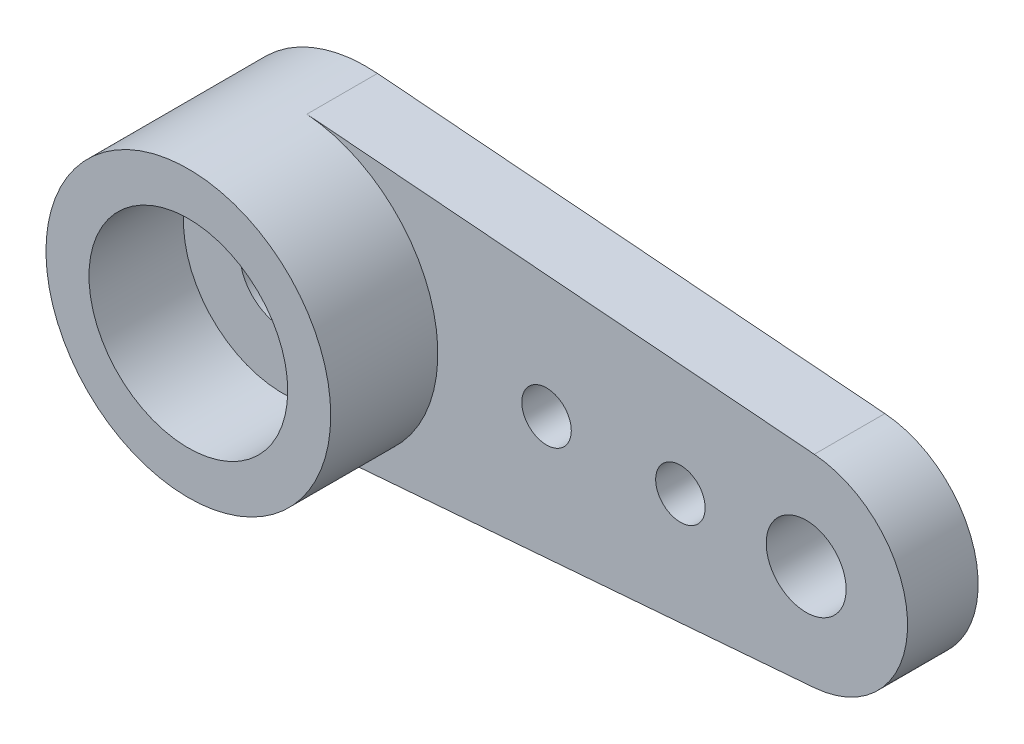
ISO-10303-21;
HEADER;
FILE_DESCRIPTION(('STEP AP214'),'2;1');
FILE_NAME('part.step','',(''),(''),'','','');
FILE_SCHEMA(('AUTOMOTIVE_DESIGN { 1 0 10303 214 1 1 1 1 }'));
ENDSEC;
DATA;
#1=APPLICATION_CONTEXT('core data for automotive mechanical design processes');
#2=APPLICATION_PROTOCOL_DEFINITION('international standard','automotive_design',2000,#1);
#3=PRODUCT_CONTEXT('',#1,'mechanical');
#4=PRODUCT('Part','Part','',(#3));
#5=PRODUCT_RELATED_PRODUCT_CATEGORY('part','',(#4));
#6=PRODUCT_DEFINITION_FORMATION('','',#4);
#7=PRODUCT_DEFINITION_CONTEXT('part definition',#1,'design');
#8=PRODUCT_DEFINITION('design','',#6,#7);
#9=PRODUCT_DEFINITION_SHAPE('','',#8);
#10=(LENGTH_UNIT() NAMED_UNIT(*) SI_UNIT(.MILLI.,.METRE.));
#11=(NAMED_UNIT(*) PLANE_ANGLE_UNIT() SI_UNIT($,.RADIAN.));
#12=(NAMED_UNIT(*) SI_UNIT($,.STERADIAN.) SOLID_ANGLE_UNIT());
#13=UNCERTAINTY_MEASURE_WITH_UNIT(LENGTH_MEASURE(1.E-05),#10,'distance_accuracy_value','');
#14=(GEOMETRIC_REPRESENTATION_CONTEXT(3) GLOBAL_UNCERTAINTY_ASSIGNED_CONTEXT((#13)) GLOBAL_UNIT_ASSIGNED_CONTEXT((#10,
#11,#12)) REPRESENTATION_CONTEXT('',''));
#15=CARTESIAN_POINT('',(0.,0.,0.));
#16=DIRECTION('',(0.,0.,1.));
#17=DIRECTION('',(1.,0.,0.));
#18=AXIS2_PLACEMENT_3D('',#15,#16,#17);
#19=CARTESIAN_POINT('',(0.,0.,1.74));
#20=DIRECTION('',(0.,0.,1.));
#21=DIRECTION('',(1.,0.,0.));
#22=AXIS2_PLACEMENT_3D('',#19,#20,#21);
#23=PLANE('',#22);
#24=CARTESIAN_POINT('',(12.59,0.,1.74));
#25=DIRECTION('',(0.,0.,1.));
#26=DIRECTION('',(1.,0.,0.));
#27=AXIS2_PLACEMENT_3D('',#24,#25,#26);
#28=CIRCLE('',#27,0.985);
#29=CARTESIAN_POINT('',(13.575,0.,1.74));
#30=VERTEX_POINT('',#29);
#31=EDGE_CURVE('E109',#30,#30,#28,.T.);
#32=ORIENTED_EDGE('',*,*,#31,.F.);
#33=EDGE_LOOP('',(#32));
#34=FACE_BOUND('',#33,.T.);
#35=CARTESIAN_POINT('',(9.49,0.,1.74));
#36=DIRECTION('',(0.,0.,1.));
#37=DIRECTION('',(1.,0.,0.));
#38=AXIS2_PLACEMENT_3D('',#35,#36,#37);
#39=CIRCLE('',#38,0.61);
#40=CARTESIAN_POINT('',(10.1,0.,1.74));
#41=VERTEX_POINT('',#40);
#42=EDGE_CURVE('E101',#41,#41,#39,.T.);
#43=ORIENTED_EDGE('',*,*,#42,.F.);
#44=EDGE_LOOP('',(#43));
#45=FACE_BOUND('',#44,.T.);
#46=CARTESIAN_POINT('',(6.19,0.,1.74));
#47=DIRECTION('',(0.,0.,1.));
#48=DIRECTION('',(1.,0.,0.));
#49=AXIS2_PLACEMENT_3D('',#46,#47,#48);
#50=CIRCLE('',#49,0.609999999999999);
#51=CARTESIAN_POINT('',(6.8,0.,1.74));
#52=VERTEX_POINT('',#51);
#53=EDGE_CURVE('E98',#52,#52,#50,.T.);
#54=ORIENTED_EDGE('',*,*,#53,.F.);
#55=EDGE_LOOP('',(#54));
#56=FACE_BOUND('',#55,.T.);
#57=DIRECTION('',(0.996776989472641,-0.0802223987291502,0.));
#58=VECTOR('',#57,1.);
#59=CARTESIAN_POINT('',(0.281580619539317,3.49868723304897,1.74));
#60=LINE('',#59,#58);
#61=CARTESIAN_POINT('',(0.281580619539317,3.49868723304897,1.74));
#62=VERTEX_POINT('',#61);
#63=CARTESIAN_POINT('',(12.7905559968229,2.4919424736816,1.74));
#64=VERTEX_POINT('',#63);
#65=EDGE_CURVE('E94',#62,#64,#60,.T.);
#66=ORIENTED_EDGE('',*,*,#65,.F.);
#67=CARTESIAN_POINT('',(0.,0.,1.74));
#68=DIRECTION('',(0.,0.,1.));
#69=DIRECTION('',(1.,0.,0.));
#70=AXIS2_PLACEMENT_3D('',#67,#68,#69);
#71=CIRCLE('',#70,3.51);
#72=CARTESIAN_POINT('',(0.281580619539316,-3.49868723304897,1.74));
#73=VERTEX_POINT('',#72);
#74=EDGE_CURVE('E56',#62,#73,#71,.F.);
#75=ORIENTED_EDGE('',*,*,#74,.T.);
#76=DIRECTION('',(0.996776989472641,0.0802223987291503,0.));
#77=VECTOR('',#76,1.);
#78=CARTESIAN_POINT('',(0.281580619539318,-3.49868723304897,1.74));
#79=LINE('',#78,#77);
#80=CARTESIAN_POINT('',(12.7905559968229,-2.4919424736816,1.74));
#81=VERTEX_POINT('',#80);
#82=EDGE_CURVE('E103',#73,#81,#79,.T.);
#83=ORIENTED_EDGE('',*,*,#82,.T.);
#84=CARTESIAN_POINT('',(12.59,0.,1.74));
#85=DIRECTION('',(0.,0.,1.));
#86=DIRECTION('',(1.,0.,0.));
#87=AXIS2_PLACEMENT_3D('',#84,#85,#86);
#88=CIRCLE('',#87,2.5);
#89=EDGE_CURVE('E81',#81,#64,#88,.T.);
#90=ORIENTED_EDGE('',*,*,#89,.T.);
#91=EDGE_LOOP('',(#66,#75,#83,#90));
#92=FACE_BOUND('',#91,.T.);
#93=ADVANCED_FACE('F39',(#34,#45,#56,#92),#23,.T.);
#94=CARTESIAN_POINT('',(0.281580619539318,-3.49868723304897,1.74));
#95=DIRECTION('',(-0.0802223987291502,0.996776989472641,0.));
#96=DIRECTION('',(-0.996776989472641,-0.0802223987291503,0.));
#97=AXIS2_PLACEMENT_3D('',#94,#95,#96);
#98=PLANE('',#97);
#99=DIRECTION('',(0.996776989472641,0.0802223987291503,0.));
#100=VECTOR('',#99,1.);
#101=CARTESIAN_POINT('',(0.281580619539318,-3.49868723304897,0.));
#102=LINE('',#101,#100);
#103=CARTESIAN_POINT('',(0.281580619539316,-3.49868723304897,0.));
#104=VERTEX_POINT('',#103);
#105=CARTESIAN_POINT('',(12.7905559968229,-2.4919424736816,0.));
#106=VERTEX_POINT('',#105);
#107=EDGE_CURVE('E87',#104,#106,#102,.T.);
#108=ORIENTED_EDGE('',*,*,#107,.T.);
#109=DIRECTION('',(0.,0.,-1.));
#110=VECTOR('',#109,1.);
#111=CARTESIAN_POINT('',(12.7905559968229,-2.4919424736816,1.74));
#112=LINE('',#111,#110);
#113=EDGE_CURVE('E11',#81,#106,#112,.T.);
#114=ORIENTED_EDGE('',*,*,#113,.F.);
#115=ORIENTED_EDGE('',*,*,#82,.F.);
#116=DIRECTION('',(0.,0.,-1.));
#117=VECTOR('',#116,1.);
#118=CARTESIAN_POINT('',(0.281580619539316,-3.49868723304897,1.74));
#119=LINE('',#118,#117);
#120=EDGE_CURVE('E85',#73,#104,#119,.T.);
#121=ORIENTED_EDGE('',*,*,#120,.T.);
#122=EDGE_LOOP('',(#108,#114,#115,#121));
#123=FACE_BOUND('',#122,.T.);
#124=ADVANCED_FACE('F41',(#123),#98,.F.);
#125=CARTESIAN_POINT('',(12.59,0.,1.74));
#126=DIRECTION('',(0.,0.,-1.));
#127=DIRECTION('',(-1.,0.,0.));
#128=AXIS2_PLACEMENT_3D('',#125,#126,#127);
#129=CYLINDRICAL_SURFACE('',#128,2.5);
#130=CARTESIAN_POINT('',(12.59,0.,0.));
#131=DIRECTION('',(0.,0.,1.));
#132=DIRECTION('',(1.,0.,0.));
#133=AXIS2_PLACEMENT_3D('',#130,#131,#132);
#134=CIRCLE('',#133,2.5);
#135=CARTESIAN_POINT('',(12.7905559968229,2.4919424736816,0.));
#136=VERTEX_POINT('',#135);
#137=EDGE_CURVE('E114',#106,#136,#134,.T.);
#138=ORIENTED_EDGE('',*,*,#137,.T.);
#139=DIRECTION('',(0.,0.,-1.));
#140=VECTOR('',#139,1.);
#141=CARTESIAN_POINT('',(12.7905559968229,2.4919424736816,1.74));
#142=LINE('',#141,#140);
#143=EDGE_CURVE('E48',#64,#136,#142,.T.);
#144=ORIENTED_EDGE('',*,*,#143,.F.);
#145=ORIENTED_EDGE('',*,*,#89,.F.);
#146=ORIENTED_EDGE('',*,*,#113,.T.);
#147=EDGE_LOOP('',(#138,#144,#145,#146));
#148=FACE_BOUND('',#147,.T.);
#149=ADVANCED_FACE('F128',(#148),#129,.T.);
#150=CARTESIAN_POINT('',(0.281580619539317,3.49868723304897,1.74));
#151=DIRECTION('',(0.0802223987291502,0.996776989472641,0.));
#152=DIRECTION('',(-0.996776989472641,0.0802223987291502,0.));
#153=AXIS2_PLACEMENT_3D('',#150,#151,#152);
#154=PLANE('',#153);
#155=DIRECTION('',(0.996776989472641,-0.0802223987291502,0.));
#156=VECTOR('',#155,1.);
#157=CARTESIAN_POINT('',(0.281580619539317,3.49868723304897,0.));
#158=LINE('',#157,#156);
#159=CARTESIAN_POINT('',(0.281580619539317,3.49868723304897,0.));
#160=VERTEX_POINT('',#159);
#161=EDGE_CURVE('E96',#160,#136,#158,.T.);
#162=ORIENTED_EDGE('',*,*,#161,.F.);
#163=DIRECTION('',(0.,0.,-1.));
#164=VECTOR('',#163,1.);
#165=CARTESIAN_POINT('',(0.281580619539317,3.49868723304897,1.74));
#166=LINE('',#165,#164);
#167=EDGE_CURVE('E74',#62,#160,#166,.T.);
#168=ORIENTED_EDGE('',*,*,#167,.F.);
#169=ORIENTED_EDGE('',*,*,#65,.T.);
#170=ORIENTED_EDGE('',*,*,#143,.T.);
#171=EDGE_LOOP('',(#162,#168,#169,#170));
#172=FACE_BOUND('',#171,.T.);
#173=ADVANCED_FACE('F93',(#172),#154,.T.);
#174=CARTESIAN_POINT('',(9.49,0.,1.74));
#175=DIRECTION('',(0.,0.,-1.));
#176=DIRECTION('',(-1.,0.,0.));
#177=AXIS2_PLACEMENT_3D('',#174,#175,#176);
#178=CYLINDRICAL_SURFACE('',#177,0.61);
#179=ORIENTED_EDGE('',*,*,#42,.T.);
#180=EDGE_LOOP('',(#179));
#181=FACE_BOUND('',#180,.T.);
#182=CARTESIAN_POINT('',(9.49,0.,0.));
#183=DIRECTION('',(0.,0.,1.));
#184=DIRECTION('',(1.,0.,0.));
#185=AXIS2_PLACEMENT_3D('',#182,#183,#184);
#186=CIRCLE('',#185,0.61);
#187=CARTESIAN_POINT('',(10.1,0.,0.));
#188=VERTEX_POINT('',#187);
#189=EDGE_CURVE('E122',#188,#188,#186,.T.);
#190=ORIENTED_EDGE('',*,*,#189,.F.);
#191=EDGE_LOOP('',(#190));
#192=FACE_BOUND('',#191,.T.);
#193=ADVANCED_FACE('F236',(#181,#192),#178,.F.);
#194=CARTESIAN_POINT('',(6.19,0.,1.74));
#195=DIRECTION('',(0.,0.,-1.));
#196=DIRECTION('',(-1.,0.,0.));
#197=AXIS2_PLACEMENT_3D('',#194,#195,#196);
#198=CYLINDRICAL_SURFACE('',#197,0.609999999999999);
#199=ORIENTED_EDGE('',*,*,#53,.T.);
#200=EDGE_LOOP('',(#199));
#201=FACE_BOUND('',#200,.T.);
#202=CARTESIAN_POINT('',(6.19,0.,0.));
#203=DIRECTION('',(0.,0.,1.));
#204=DIRECTION('',(1.,0.,0.));
#205=AXIS2_PLACEMENT_3D('',#202,#203,#204);
#206=CIRCLE('',#205,0.609999999999999);
#207=CARTESIAN_POINT('',(6.8,0.,0.));
#208=VERTEX_POINT('',#207);
#209=EDGE_CURVE('E119',#208,#208,#206,.T.);
#210=ORIENTED_EDGE('',*,*,#209,.F.);
#211=EDGE_LOOP('',(#210));
#212=FACE_BOUND('',#211,.T.);
#213=ADVANCED_FACE('F231',(#201,#212),#198,.F.);
#214=CARTESIAN_POINT('',(0.,0.,1.74));
#215=DIRECTION('',(0.,0.,-1.));
#216=DIRECTION('',(-1.,0.,0.));
#217=AXIS2_PLACEMENT_3D('',#214,#215,#216);
#218=CYLINDRICAL_SURFACE('',#217,3.51);
#219=CARTESIAN_POINT('',(0.,0.,0.));
#220=DIRECTION('',(0.,0.,1.));
#221=DIRECTION('',(1.,0.,0.));
#222=AXIS2_PLACEMENT_3D('',#219,#220,#221);
#223=CIRCLE('',#222,3.51);
#224=EDGE_CURVE('E76',#160,#104,#223,.T.);
#225=ORIENTED_EDGE('',*,*,#224,.T.);
#226=ORIENTED_EDGE('',*,*,#120,.F.);
#227=ORIENTED_EDGE('',*,*,#74,.F.);
#228=ORIENTED_EDGE('',*,*,#167,.T.);
#229=EDGE_LOOP('',(#225,#226,#227,#228));
#230=FACE_BOUND('',#229,.T.);
#231=CARTESIAN_POINT('',(0.,0.,4.38));
#232=DIRECTION('',(0.,0.,1.));
#233=DIRECTION('',(1.,0.,0.));
#234=AXIS2_PLACEMENT_3D('',#231,#232,#233);
#235=CIRCLE('',#234,3.51);
#236=CARTESIAN_POINT('',(3.51,0.,4.38));
#237=VERTEX_POINT('',#236);
#238=EDGE_CURVE('E88',#237,#237,#235,.T.);
#239=ORIENTED_EDGE('',*,*,#238,.F.);
#240=EDGE_LOOP('',(#239));
#241=FACE_BOUND('',#240,.T.);
#242=ADVANCED_FACE('F83',(#230,#241),#218,.T.);
#243=CARTESIAN_POINT('',(12.59,0.,1.74));
#244=DIRECTION('',(0.,0.,-1.));
#245=DIRECTION('',(-1.,0.,0.));
#246=AXIS2_PLACEMENT_3D('',#243,#244,#245);
#247=CYLINDRICAL_SURFACE('',#246,0.985);
#248=ORIENTED_EDGE('',*,*,#31,.T.);
#249=EDGE_LOOP('',(#248));
#250=FACE_BOUND('',#249,.T.);
#251=CARTESIAN_POINT('',(12.59,0.,0.));
#252=DIRECTION('',(0.,0.,1.));
#253=DIRECTION('',(1.,0.,0.));
#254=AXIS2_PLACEMENT_3D('',#251,#252,#253);
#255=CIRCLE('',#254,0.985);
#256=CARTESIAN_POINT('',(13.575,0.,0.));
#257=VERTEX_POINT('',#256);
#258=EDGE_CURVE('E125',#257,#257,#255,.T.);
#259=ORIENTED_EDGE('',*,*,#258,.F.);
#260=EDGE_LOOP('',(#259));
#261=FACE_BOUND('',#260,.T.);
#262=ADVANCED_FACE('F193',(#250,#261),#247,.F.);
#263=CARTESIAN_POINT('',(0.,0.,0.));
#264=DIRECTION('',(0.,0.,1.));
#265=DIRECTION('',(1.,0.,0.));
#266=AXIS2_PLACEMENT_3D('',#263,#264,#265);
#267=PLANE('',#266);
#268=CARTESIAN_POINT('',(0.,0.,0.));
#269=DIRECTION('',(0.,0.,1.));
#270=DIRECTION('',(1.,0.,0.));
#271=AXIS2_PLACEMENT_3D('',#268,#269,#270);
#272=CIRCLE('',#271,2.7);
#273=CARTESIAN_POINT('',(2.7,0.,0.));
#274=VERTEX_POINT('',#273);
#275=EDGE_CURVE('E138',#274,#274,#272,.T.);
#276=ORIENTED_EDGE('',*,*,#275,.T.);
#277=EDGE_LOOP('',(#276));
#278=FACE_BOUND('',#277,.T.);
#279=ORIENTED_EDGE('',*,*,#224,.F.);
#280=ORIENTED_EDGE('',*,*,#161,.T.);
#281=ORIENTED_EDGE('',*,*,#137,.F.);
#282=ORIENTED_EDGE('',*,*,#107,.F.);
#283=EDGE_LOOP('',(#279,#280,#281,#282));
#284=FACE_BOUND('',#283,.T.);
#285=ORIENTED_EDGE('',*,*,#258,.T.);
#286=EDGE_LOOP('',(#285));
#287=FACE_BOUND('',#286,.T.);
#288=ORIENTED_EDGE('',*,*,#189,.T.);
#289=EDGE_LOOP('',(#288));
#290=FACE_BOUND('',#289,.T.);
#291=ORIENTED_EDGE('',*,*,#209,.T.);
#292=EDGE_LOOP('',(#291));
#293=FACE_BOUND('',#292,.T.);
#294=ADVANCED_FACE('F132',(#278,#284,#287,#290,#293),#267,.F.);
#295=CARTESIAN_POINT('',(0.,0.,4.38));
#296=DIRECTION('',(0.,0.,1.));
#297=DIRECTION('',(1.,0.,0.));
#298=AXIS2_PLACEMENT_3D('',#295,#296,#297);
#299=PLANE('',#298);
#300=CARTESIAN_POINT('',(0.,0.,4.38));
#301=DIRECTION('',(0.,0.,1.));
#302=DIRECTION('',(1.,0.,0.));
#303=AXIS2_PLACEMENT_3D('',#300,#301,#302);
#304=CIRCLE('',#303,2.45);
#305=CARTESIAN_POINT('',(2.45,0.,4.38));
#306=VERTEX_POINT('',#305);
#307=EDGE_CURVE('E145',#306,#306,#304,.T.);
#308=ORIENTED_EDGE('',*,*,#307,.F.);
#309=EDGE_LOOP('',(#308));
#310=FACE_BOUND('',#309,.T.);
#311=ORIENTED_EDGE('',*,*,#238,.T.);
#312=EDGE_LOOP('',(#311));
#313=FACE_BOUND('',#312,.T.);
#314=ADVANCED_FACE('F188',(#310,#313),#299,.T.);
#315=CARTESIAN_POINT('',(0.,0.,-0.67));
#316=DIRECTION('',(0.,0.,1.));
#317=DIRECTION('',(1.,0.,0.));
#318=AXIS2_PLACEMENT_3D('',#315,#316,#317);
#319=CYLINDRICAL_SURFACE('',#318,2.7);
#320=CARTESIAN_POINT('',(0.,0.,-0.67));
#321=DIRECTION('',(0.,0.,1.));
#322=DIRECTION('',(1.,0.,0.));
#323=AXIS2_PLACEMENT_3D('',#320,#321,#322);
#324=CIRCLE('',#323,2.7);
#325=CARTESIAN_POINT('',(2.7,0.,-0.67));
#326=VERTEX_POINT('',#325);
#327=EDGE_CURVE('E141',#326,#326,#324,.T.);
#328=ORIENTED_EDGE('',*,*,#327,.T.);
#329=EDGE_LOOP('',(#328));
#330=FACE_BOUND('',#329,.T.);
#331=ORIENTED_EDGE('',*,*,#275,.F.);
#332=EDGE_LOOP('',(#331));
#333=FACE_BOUND('',#332,.T.);
#334=ADVANCED_FACE('F182',(#330,#333),#319,.T.);
#335=CARTESIAN_POINT('',(0.,0.,-0.67));
#336=DIRECTION('',(0.,0.,1.));
#337=DIRECTION('',(1.,0.,0.));
#338=AXIS2_PLACEMENT_3D('',#335,#336,#337);
#339=PLANE('',#338);
#340=CARTESIAN_POINT('',(0.,0.,-0.67));
#341=DIRECTION('',(0.,0.,-1.));
#342=DIRECTION('',(-1.,0.,0.));
#343=AXIS2_PLACEMENT_3D('',#340,#341,#342);
#344=CIRCLE('',#343,2.);
#345=CARTESIAN_POINT('',(-2.,0.,-0.669999999999999));
#346=VERTEX_POINT('',#345);
#347=EDGE_CURVE('E151',#346,#346,#344,.T.);
#348=ORIENTED_EDGE('',*,*,#347,.F.);
#349=EDGE_LOOP('',(#348));
#350=FACE_BOUND('',#349,.T.);
#351=ORIENTED_EDGE('',*,*,#327,.F.);
#352=EDGE_LOOP('',(#351));
#353=FACE_BOUND('',#352,.T.);
#354=ADVANCED_FACE('F178',(#350,#353),#339,.F.);
#355=CARTESIAN_POINT('',(0.,0.,2.05));
#356=DIRECTION('',(0.,0.,1.));
#357=DIRECTION('',(1.,0.,0.));
#358=AXIS2_PLACEMENT_3D('',#355,#356,#357);
#359=CYLINDRICAL_SURFACE('',#358,2.45);
#360=CARTESIAN_POINT('',(0.,0.,2.05));
#361=DIRECTION('',(0.,0.,1.));
#362=DIRECTION('',(1.,0.,0.));
#363=AXIS2_PLACEMENT_3D('',#360,#361,#362);
#364=CIRCLE('',#363,2.45);
#365=CARTESIAN_POINT('',(2.45,0.,2.05));
#366=VERTEX_POINT('',#365);
#367=EDGE_CURVE('E144',#366,#366,#364,.T.);
#368=ORIENTED_EDGE('',*,*,#367,.F.);
#369=EDGE_LOOP('',(#368));
#370=FACE_BOUND('',#369,.T.);
#371=ORIENTED_EDGE('',*,*,#307,.T.);
#372=EDGE_LOOP('',(#371));
#373=FACE_BOUND('',#372,.T.);
#374=ADVANCED_FACE('F181',(#370,#373),#359,.F.);
#375=CARTESIAN_POINT('',(0.,0.,2.05));
#376=DIRECTION('',(0.,0.,1.));
#377=DIRECTION('',(1.,0.,0.));
#378=AXIS2_PLACEMENT_3D('',#375,#376,#377);
#379=PLANE('',#378);
#380=CARTESIAN_POINT('',(0.,0.,2.05));
#381=DIRECTION('',(0.,0.,1.));
#382=DIRECTION('',(1.,0.,0.));
#383=AXIS2_PLACEMENT_3D('',#380,#381,#382);
#384=CIRCLE('',#383,1.06);
#385=CARTESIAN_POINT('',(1.06,0.,2.05));
#386=VERTEX_POINT('',#385);
#387=EDGE_CURVE('E157',#386,#386,#384,.F.);
#388=ORIENTED_EDGE('',*,*,#387,.T.);
#389=EDGE_LOOP('',(#388));
#390=FACE_BOUND('',#389,.T.);
#391=ORIENTED_EDGE('',*,*,#367,.T.);
#392=EDGE_LOOP('',(#391));
#393=FACE_BOUND('',#392,.T.);
#394=ADVANCED_FACE('F174',(#390,#393),#379,.T.);
#395=CARTESIAN_POINT('',(0.,0.,0.68));
#396=DIRECTION('',(0.,0.,-1.));
#397=DIRECTION('',(-1.,0.,0.));
#398=AXIS2_PLACEMENT_3D('',#395,#396,#397);
#399=CYLINDRICAL_SURFACE('',#398,2.);
#400=CARTESIAN_POINT('',(0.,0.,0.68));
#401=DIRECTION('',(0.,0.,-1.));
#402=DIRECTION('',(-1.,0.,0.));
#403=AXIS2_PLACEMENT_3D('',#400,#401,#402);
#404=CIRCLE('',#403,2.);
#405=CARTESIAN_POINT('',(-2.,0.,0.68));
#406=VERTEX_POINT('',#405);
#407=EDGE_CURVE('E148',#406,#406,#404,.T.);
#408=CARTESIAN_POINT('',(-2.,0.,0.68));
#409=CARTESIAN_POINT('',(-2.,0.,0.665937500000001));
#410=CARTESIAN_POINT('',(-2.,0.,0.651875000000001));
#411=CARTESIAN_POINT('',(-2.,0.,0.623750000000001));
#412=CARTESIAN_POINT('',(-2.,0.,0.6096875));
#413=CARTESIAN_POINT('',(-2.,0.,0.581562500000001));
#414=CARTESIAN_POINT('',(-2.,0.,0.567500000000001));
#415=CARTESIAN_POINT('',(-2.,0.,0.539375000000001));
#416=CARTESIAN_POINT('',(-2.,0.,0.525312500000001));
#417=CARTESIAN_POINT('',(-2.,0.,0.497187500000001));
#418=CARTESIAN_POINT('',(-2.,0.,0.483125000000001));
#419=CARTESIAN_POINT('',(-2.,0.,0.455000000000001));
#420=CARTESIAN_POINT('',(-2.,0.,0.440937500000001));
#421=CARTESIAN_POINT('',(-2.,0.,0.412812500000001));
#422=CARTESIAN_POINT('',(-2.,0.,0.398750000000001));
#423=CARTESIAN_POINT('',(-2.,0.,0.370625000000001));
#424=CARTESIAN_POINT('',(-2.,0.,0.356562500000001));
#425=CARTESIAN_POINT('',(-2.,0.,0.328437500000001));
#426=CARTESIAN_POINT('',(-2.,0.,0.314375000000001));
#427=CARTESIAN_POINT('',(-2.,0.,0.286250000000001));
#428=CARTESIAN_POINT('',(-2.,0.,0.272187500000001));
#429=CARTESIAN_POINT('',(-2.,0.,0.244062500000001));
#430=CARTESIAN_POINT('',(-2.,0.,0.230000000000001));
#431=CARTESIAN_POINT('',(-2.,0.,0.201875000000001));
#432=CARTESIAN_POINT('',(-2.,0.,0.187812500000001));
#433=CARTESIAN_POINT('',(-2.,0.,0.159687500000001));
#434=CARTESIAN_POINT('',(-2.,0.,0.145625000000001));
#435=CARTESIAN_POINT('',(-2.,0.,0.117500000000001));
#436=CARTESIAN_POINT('',(-2.,0.,0.103437500000001));
#437=CARTESIAN_POINT('',(-2.,0.,0.0753125000000006));
#438=CARTESIAN_POINT('',(-2.,0.,0.0612500000000006));
#439=CARTESIAN_POINT('',(-2.,0.,0.0331250000000006));
#440=CARTESIAN_POINT('',(-2.,0.,0.0190625000000006));
#441=CARTESIAN_POINT('',(-2.,0.,-0.00906249999999945));
#442=CARTESIAN_POINT('',(-2.,0.,-0.0231249999999995));
#443=CARTESIAN_POINT('',(-2.,0.,-0.0512499999999995));
#444=CARTESIAN_POINT('',(-2.,0.,-0.0653124999999995));
#445=CARTESIAN_POINT('',(-2.,0.,-0.0934374999999995));
#446=CARTESIAN_POINT('',(-2.,0.,-0.107499999999999));
#447=CARTESIAN_POINT('',(-2.,0.,-0.135624999999999));
#448=CARTESIAN_POINT('',(-2.,0.,-0.1496875));
#449=CARTESIAN_POINT('',(-2.,0.,-0.177812499999999));
#450=CARTESIAN_POINT('',(-2.,0.,-0.191874999999999));
#451=CARTESIAN_POINT('',(-2.,0.,-0.219999999999999));
#452=CARTESIAN_POINT('',(-2.,0.,-0.234062499999999));
#453=CARTESIAN_POINT('',(-2.,0.,-0.262187499999999));
#454=CARTESIAN_POINT('',(-2.,0.,-0.276249999999999));
#455=CARTESIAN_POINT('',(-2.,0.,-0.304374999999999));
#456=CARTESIAN_POINT('',(-2.,0.,-0.318437499999999));
#457=CARTESIAN_POINT('',(-2.,0.,-0.346562499999999));
#458=CARTESIAN_POINT('',(-2.,0.,-0.360624999999999));
#459=CARTESIAN_POINT('',(-2.,0.,-0.388749999999999));
#460=CARTESIAN_POINT('',(-2.,0.,-0.402812499999999));
#461=CARTESIAN_POINT('',(-2.,0.,-0.430937499999999));
#462=CARTESIAN_POINT('',(-2.,0.,-0.444999999999999));
#463=CARTESIAN_POINT('',(-2.,0.,-0.473124999999999));
#464=CARTESIAN_POINT('',(-2.,0.,-0.487187499999999));
#465=CARTESIAN_POINT('',(-2.,0.,-0.515312499999999));
#466=CARTESIAN_POINT('',(-2.,0.,-0.529374999999999));
#467=CARTESIAN_POINT('',(-2.,0.,-0.557499999999999));
#468=CARTESIAN_POINT('',(-2.,0.,-0.571562499999999));
#469=CARTESIAN_POINT('',(-2.,0.,-0.599687499999999));
#470=CARTESIAN_POINT('',(-2.,0.,-0.613749999999999));
#471=CARTESIAN_POINT('',(-2.,0.,-0.641874999999999));
#472=CARTESIAN_POINT('',(-2.,0.,-0.655937499999999));
#473=CARTESIAN_POINT('',(-2.,0.,-0.669999999999999));
#474=B_SPLINE_CURVE_WITH_KNOTS('',3,(#408,#409,#410,#411,#412,#413,#414,#415,#416,#417,#418,
#419,#420,#421,#422,#423,#424,#425,#426,#427,#428,#429,#430,#431,#432,#433,#434,#435,#436,#437,
#438,#439,#440,#441,#442,#443,#444,#445,#446,#447,#448,#449,#450,#451,#452,#453,#454,#455,#456,
#457,#458,#459,#460,#461,#462,#463,#464,#465,#466,#467,#468,#469,#470,#471,#472,#473),
.UNSPECIFIED.,.F.,.F.,(4,2,2,2,2,2,2,2,2,2,2,2,2,2,2,2,2,2,2,2,2,2,2,2,2,2,2,2,2,2,2,2,4),(0.,
0.0421874999999999,0.0843749999999999,0.1265625,0.16875,0.2109375,0.253125,0.2953125,0.3375,
0.3796875,0.421875,0.4640625,0.50625,0.5484375,0.590625,0.6328125,0.675,0.7171875,0.759375,
0.8015625,0.84375,0.8859375,0.928125,0.9703125,1.0125,1.0546875,1.096875,1.1390625,1.18125,
1.2234375,1.265625,1.3078125,1.35),.UNSPECIFIED.);
#475=EDGE_CURVE('BSEAM168',#406,#346,#474,.T.);
#476=ORIENTED_EDGE('',*,*,#407,.F.);
#477=ORIENTED_EDGE('',*,*,#347,.T.);
#478=ORIENTED_EDGE('',*,*,#475,.T.);
#479=ORIENTED_EDGE('',*,*,#475,.F.);
#480=EDGE_LOOP('',(#476,#478,#477,#479));
#481=FACE_BOUND('',#480,.T.);
#482=ADVANCED_FACE('F168',(#481),#399,.F.);
#483=CARTESIAN_POINT('',(0.,0.,0.68));
#484=DIRECTION('',(0.,0.,-1.));
#485=DIRECTION('',(-1.,0.,0.));
#486=AXIS2_PLACEMENT_3D('',#483,#484,#485);
#487=PLANE('',#486);
#488=CARTESIAN_POINT('',(0.,0.,0.68));
#489=DIRECTION('',(0.,0.,-1.));
#490=DIRECTION('',(-1.,0.,0.));
#491=AXIS2_PLACEMENT_3D('',#488,#489,#490);
#492=CIRCLE('',#491,1.06);
#493=CARTESIAN_POINT('',(-1.06,0.,0.68));
#494=VERTEX_POINT('',#493);
#495=EDGE_CURVE('E154',#494,#494,#492,.T.);
#496=ORIENTED_EDGE('',*,*,#495,.F.);
#497=EDGE_LOOP('',(#496));
#498=FACE_BOUND('',#497,.T.);
#499=ORIENTED_EDGE('',*,*,#407,.T.);
#500=EDGE_LOOP('',(#499));
#501=FACE_BOUND('',#500,.T.);
#502=ADVANCED_FACE('F165',(#498,#501),#487,.T.);
#503=CARTESIAN_POINT('',(0.,0.,4.381));
#504=DIRECTION('',(0.,0.,-1.));
#505=DIRECTION('',(-1.,0.,0.));
#506=AXIS2_PLACEMENT_3D('',#503,#504,#505);
#507=CYLINDRICAL_SURFACE('',#506,1.06);
#508=ORIENTED_EDGE('',*,*,#387,.F.);
#509=EDGE_LOOP('',(#508));
#510=FACE_BOUND('',#509,.T.);
#511=ORIENTED_EDGE('',*,*,#495,.T.);
#512=EDGE_LOOP('',(#511));
#513=FACE_BOUND('',#512,.T.);
#514=ADVANCED_FACE('F163',(#510,#513),#507,.F.);
#515=CLOSED_SHELL('',(#93,#124,#149,#173,#193,#213,#242,#262,#294,#314,#334,#354,#374,#394,#482,
#502,#514));
#516=MANIFOLD_SOLID_BREP('B2',#515);
#517=ADVANCED_BREP_SHAPE_REPRESENTATION('',(#18,#516),#14);
#518=SHAPE_DEFINITION_REPRESENTATION(#9,#517);
ENDSEC;
END-ISO-10303-21;
